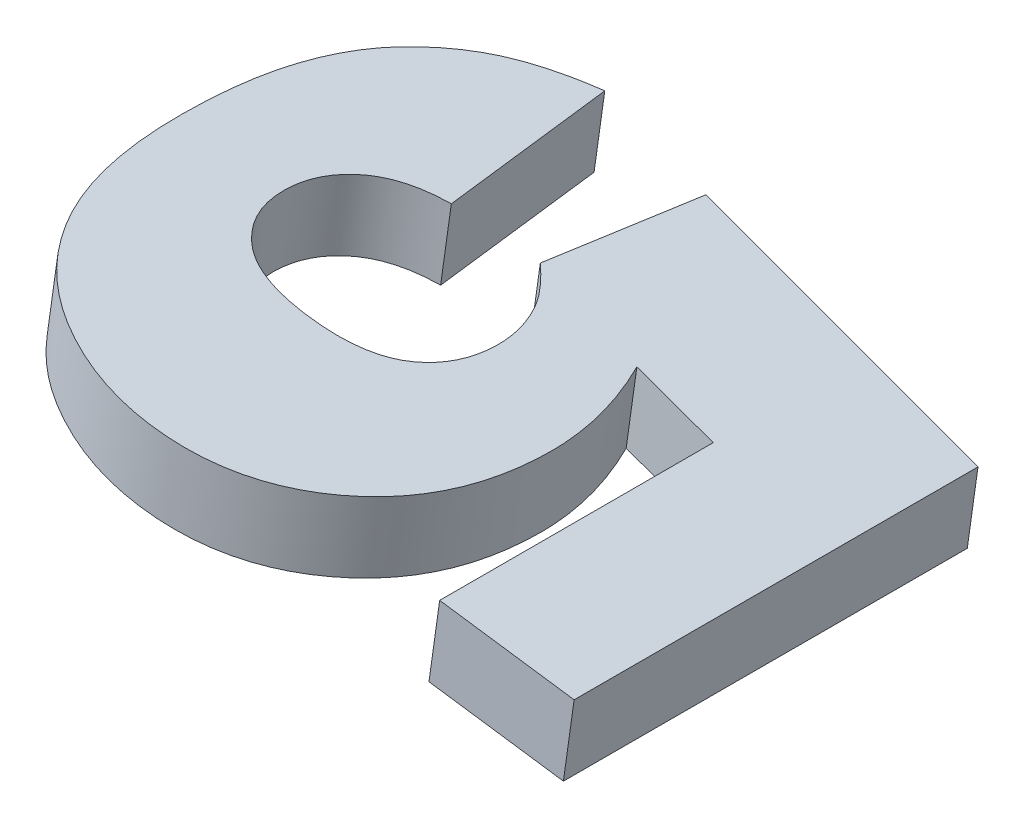
ISO-10303-21;
HEADER;
FILE_DESCRIPTION(('STEP AP214'),'2;1');
FILE_NAME('part.step','',(''),(''),'','','');
FILE_SCHEMA(('AUTOMOTIVE_DESIGN { 1 0 10303 214 1 1 1 1 }'));
ENDSEC;
DATA;
#1=APPLICATION_CONTEXT('core data for automotive mechanical design processes');
#2=APPLICATION_PROTOCOL_DEFINITION('international standard','automotive_design',2000,#1);
#3=PRODUCT_CONTEXT('',#1,'mechanical');
#4=PRODUCT('Part','Part','',(#3));
#5=PRODUCT_RELATED_PRODUCT_CATEGORY('part','',(#4));
#6=PRODUCT_DEFINITION_FORMATION('','',#4);
#7=PRODUCT_DEFINITION_CONTEXT('part definition',#1,'design');
#8=PRODUCT_DEFINITION('design','',#6,#7);
#9=PRODUCT_DEFINITION_SHAPE('','',#8);
#10=(LENGTH_UNIT() NAMED_UNIT(*) SI_UNIT(.MILLI.,.METRE.));
#11=(NAMED_UNIT(*) PLANE_ANGLE_UNIT() SI_UNIT($,.RADIAN.));
#12=(NAMED_UNIT(*) SI_UNIT($,.STERADIAN.) SOLID_ANGLE_UNIT());
#13=UNCERTAINTY_MEASURE_WITH_UNIT(LENGTH_MEASURE(1.E-05),#10,'distance_accuracy_value','');
#14=(GEOMETRIC_REPRESENTATION_CONTEXT(3) GLOBAL_UNCERTAINTY_ASSIGNED_CONTEXT((#13)) GLOBAL_UNIT_ASSIGNED_CONTEXT((#10,
#11,#12)) REPRESENTATION_CONTEXT('',''));
#15=CARTESIAN_POINT('',(0.,0.,0.));
#16=DIRECTION('',(0.,0.,1.));
#17=DIRECTION('',(1.,0.,0.));
#18=AXIS2_PLACEMENT_3D('',#15,#16,#17);
#19=CARTESIAN_POINT('',(883.792924410687,612.161776448019,2523.15525596255));
#20=DIRECTION('',(0.990268068741567,-0.139173100960088,0.));
#21=DIRECTION('',(-0.000106014336868243,-0.000754331202662148,-0.999999709872657));
#22=AXIS2_PLACEMENT_3D('',#19,#20,#21);
#23=PLANE('',#22);
#24=CARTESIAN_POINT('',(882.401193804865,602.259098633641,2523.16287340703));
#25=CARTESIAN_POINT('',(882.403990963494,602.279001451458,2549.54758607952));
#26=CARTESIAN_POINT('',(882.406788122123,602.298904269274,2575.93229875201));
#27=B_SPLINE_CURVE_WITH_KNOTS('',2,(#24,#25,#26),.UNSPECIFIED.,.F.,.F.,(3,3),(0.,1.),.UNSPECIFIED.);
#28=CARTESIAN_POINT('',(882.401193804865,602.259098633641,2523.16287340703));
#29=VERTEX_POINT('',#28);
#30=CARTESIAN_POINT('',(882.406788122123,602.298904269274,2575.93229875201));
#31=VERTEX_POINT('',#30);
#32=EDGE_CURVE('E129',#29,#31,#27,.T.);
#33=ORIENTED_EDGE('',*,*,#32,.F.);
#34=DIRECTION('',(-0.139173060582166,-0.990267781437723,0.000761744447259926));
#35=VECTOR('',#34,1.);
#36=CARTESIAN_POINT('',(883.792924410687,612.161776448019,2523.15525596255));
#37=LINE('',#36,#35);
#38=CARTESIAN_POINT('',(883.792924410687,612.161776448019,2523.15525596255));
#39=VERTEX_POINT('',#38);
#40=EDGE_CURVE('E33',#39,#29,#37,.T.);
#41=ORIENTED_EDGE('',*,*,#40,.F.);
#42=CARTESIAN_POINT('',(883.792924410687,612.161776448019,2523.15525596255));
#43=CARTESIAN_POINT('',(883.795721569316,612.181679265835,2549.53996863505));
#44=CARTESIAN_POINT('',(883.798518727945,612.201582083652,2575.92468130754));
#45=B_SPLINE_CURVE_WITH_KNOTS('',2,(#42,#43,#44),.UNSPECIFIED.,.F.,.F.,(3,3),(0.,1.),.UNSPECIFIED.);
#46=CARTESIAN_POINT('',(883.798518727945,612.201582083652,2575.92468130754));
#47=VERTEX_POINT('',#46);
#48=EDGE_CURVE('E197',#39,#47,#45,.T.);
#49=ORIENTED_EDGE('',*,*,#48,.T.);
#50=DIRECTION('',(-0.139173060582166,-0.990267781437723,0.000761744447259926));
#51=VECTOR('',#50,1.);
#52=CARTESIAN_POINT('',(883.798518727945,612.201582083652,2575.92468130754));
#53=LINE('',#52,#51);
#54=EDGE_CURVE('E11',#47,#31,#53,.T.);
#55=ORIENTED_EDGE('',*,*,#54,.T.);
#56=EDGE_LOOP('',(#33,#41,#49,#55));
#57=FACE_BOUND('',#56,.T.);
#58=ADVANCED_FACE('F17',(#57),#23,.T.);
#59=CARTESIAN_POINT('',(883.798518727945,612.201582083652,2575.92468130754));
#60=DIRECTION('',(0.000106014336856752,0.000754331202663758,0.999999709872657));
#61=DIRECTION('',(0.990268068741567,-0.139173100960088,0.));
#62=AXIS2_PLACEMENT_3D('',#59,#60,#61);
#63=PLANE('',#62);
#64=CARTESIAN_POINT('',(882.406788122123,602.298904269274,2575.93229875201));
#65=CARTESIAN_POINT('',(873.625420527552,603.533045000844,2575.93229875201));
#66=CARTESIAN_POINT('',(864.844052932982,604.767185732414,2575.93229875201));
#67=B_SPLINE_CURVE_WITH_KNOTS('',2,(#64,#65,#66),.UNSPECIFIED.,.F.,.F.,(3,3),(1.,2.),.UNSPECIFIED.);
#68=CARTESIAN_POINT('',(864.844052932982,604.767185732414,2575.93229875201));
#69=VERTEX_POINT('',#68);
#70=EDGE_CURVE('E137',#31,#69,#67,.T.);
#71=ORIENTED_EDGE('',*,*,#70,.F.);
#72=ORIENTED_EDGE('',*,*,#54,.F.);
#73=CARTESIAN_POINT('',(883.798518727945,612.201582083652,2575.92468130754));
#74=CARTESIAN_POINT('',(875.017151133374,613.435722815221,2575.92468130754));
#75=CARTESIAN_POINT('',(866.235783538803,614.669863546791,2575.92468130754));
#76=B_SPLINE_CURVE_WITH_KNOTS('',2,(#73,#74,#75),.UNSPECIFIED.,.F.,.F.,(3,3),(1.,2.),.UNSPECIFIED.);
#77=CARTESIAN_POINT('',(866.235783538803,614.669863546791,2575.92468130754));
#78=VERTEX_POINT('',#77);
#79=EDGE_CURVE('E211',#47,#78,#76,.T.);
#80=ORIENTED_EDGE('',*,*,#79,.T.);
#81=DIRECTION('',(-0.139173060582166,-0.990267781437723,0.000761744447259926));
#82=VECTOR('',#81,1.);
#83=CARTESIAN_POINT('',(866.235783538803,614.669863546791,2575.92468130754));
#84=LINE('',#83,#82);
#85=EDGE_CURVE('E25',#78,#69,#84,.T.);
#86=ORIENTED_EDGE('',*,*,#85,.T.);
#87=EDGE_LOOP('',(#71,#72,#80,#86));
#88=FACE_BOUND('',#87,.T.);
#89=ADVANCED_FACE('F210',(#88),#63,.T.);
#90=CARTESIAN_POINT('',(866.235783538803,614.669863546791,2575.92468130754));
#91=DIRECTION('',(-0.990268068741567,0.139173100960088,0.));
#92=DIRECTION('',(0.000106014336864579,0.000754331202662655,0.999999709872657));
#93=AXIS2_PLACEMENT_3D('',#90,#91,#92);
#94=PLANE('',#93);
#95=CARTESIAN_POINT('',(864.844052932982,604.767185732414,2575.93229875201));
#96=CARTESIAN_POINT('',(864.842158270208,604.753704506281,2558.06054404624));
#97=CARTESIAN_POINT('',(864.840263607435,604.740223280149,2540.18878934046));
#98=B_SPLINE_CURVE_WITH_KNOTS('',2,(#95,#96,#97),.UNSPECIFIED.,.F.,.F.,(3,3),(2.,3.),.UNSPECIFIED.);
#99=CARTESIAN_POINT('',(864.840263607435,604.740223280149,2540.18878934046));
#100=VERTEX_POINT('',#99);
#101=EDGE_CURVE('E145',#69,#100,#98,.T.);
#102=ORIENTED_EDGE('',*,*,#101,.F.);
#103=ORIENTED_EDGE('',*,*,#85,.F.);
#104=CARTESIAN_POINT('',(866.235783538803,614.669863546791,2575.92468130754));
#105=CARTESIAN_POINT('',(866.23388887603,614.656382320658,2558.05292660177));
#106=CARTESIAN_POINT('',(866.231994213256,614.642901094527,2540.18117189599));
#107=B_SPLINE_CURVE_WITH_KNOTS('',2,(#104,#105,#106),.UNSPECIFIED.,.F.,.F.,(3,3),(2.,3.),.UNSPECIFIED.);
#108=CARTESIAN_POINT('',(866.231994213256,614.642901094527,2540.18117189599));
#109=VERTEX_POINT('',#108);
#110=EDGE_CURVE('E220',#78,#109,#107,.T.);
#111=ORIENTED_EDGE('',*,*,#110,.T.);
#112=DIRECTION('',(-0.139173060582166,-0.990267781437723,0.000761744447259926));
#113=VECTOR('',#112,1.);
#114=CARTESIAN_POINT('',(866.231994213256,614.642901094527,2540.18117189599));
#115=LINE('',#114,#113);
#116=EDGE_CURVE('E208',#109,#100,#115,.T.);
#117=ORIENTED_EDGE('',*,*,#116,.T.);
#118=EDGE_LOOP('',(#102,#103,#111,#117));
#119=FACE_BOUND('',#118,.T.);
#120=ADVANCED_FACE('F215',(#119),#94,.T.);
#121=CARTESIAN_POINT('',(866.231994213256,614.642901094527,2540.18117189599));
#122=DIRECTION('',(-0.15548131820988,0.0226111511801645,0.987580019811066));
#123=DIRECTION('',(0.977985899129385,-0.137326096896103,0.15711500315174));
#124=AXIS2_PLACEMENT_3D('',#121,#122,#123);
#125=PLANE('',#124);
#126=CARTESIAN_POINT('',(864.840263607435,604.740223280149,2540.18878934046));
#127=CARTESIAN_POINT('',(858.895851994203,605.574921250658,2539.23381008138));
#128=CARTESIAN_POINT('',(852.951440380972,606.409619221166,2538.27883082229));
#129=B_SPLINE_CURVE_WITH_KNOTS('',2,(#126,#127,#128),.UNSPECIFIED.,.F.,.F.,(3,3),(3.,4.),.UNSPECIFIED.);
#130=CARTESIAN_POINT('',(852.951440380972,606.409619221166,2538.27883082229));
#131=VERTEX_POINT('',#130);
#132=EDGE_CURVE('E153',#100,#131,#129,.T.);
#133=ORIENTED_EDGE('',*,*,#132,.F.);
#134=ORIENTED_EDGE('',*,*,#116,.F.);
#135=CARTESIAN_POINT('',(866.231994213256,614.642901094527,2540.18117189599));
#136=CARTESIAN_POINT('',(860.287582600025,615.477599065035,2539.2261926369));
#137=CARTESIAN_POINT('',(854.343170986794,616.312297035543,2538.27121337782));
#138=B_SPLINE_CURVE_WITH_KNOTS('',2,(#135,#136,#137),.UNSPECIFIED.,.F.,.F.,(3,3),(3.,4.),.UNSPECIFIED.);
#139=CARTESIAN_POINT('',(854.343170986794,616.312297035543,2538.27121337782));
#140=VERTEX_POINT('',#139);
#141=EDGE_CURVE('E236',#109,#140,#138,.T.);
#142=ORIENTED_EDGE('',*,*,#141,.T.);
#143=DIRECTION('',(-0.139173060582166,-0.990267781437723,0.000761744447259926));
#144=VECTOR('',#143,1.);
#145=CARTESIAN_POINT('',(854.343170986794,616.312297035543,2538.27121337782));
#146=LINE('',#145,#144);
#147=EDGE_CURVE('E206',#140,#131,#146,.T.);
#148=ORIENTED_EDGE('',*,*,#147,.T.);
#149=EDGE_LOOP('',(#133,#134,#142,#148));
#150=FACE_BOUND('',#149,.T.);
#151=ADVANCED_FACE('F263',(#150),#125,.T.);
#152=CARTESIAN_POINT('',(854.343170986794,616.312297035543,2538.27121337782));
#153=CARTESIAN_POINT('',(856.072818308738,616.072065400676,2541.98198992741));
#154=CARTESIAN_POINT('',(856.937829989681,615.953287414843,2545.61091111195));
#155=CARTESIAN_POINT('',(857.802841670623,615.83450942901,2549.23983229648));
#156=CARTESIAN_POINT('',(857.803217710563,615.837185092212,2552.78689811594));
#157=CARTESIAN_POINT('',(857.804490461128,615.846241183049,2564.79235165875));
#158=CARTESIAN_POINT('',(850.618071406368,616.861977379636,2572.26847500132));
#159=CARTESIAN_POINT('',(843.431652351608,617.877713576223,2579.74459834388));
#160=CARTESIAN_POINT('',(832.515736941742,619.411845439466,2579.74459834388));
#161=CARTESIAN_POINT('',(824.842172643717,620.490294571053,2579.74459834388));
#162=CARTESIAN_POINT('',(817.762631524159,621.482299803031,2575.89739618585));
#163=CARTESIAN_POINT('',(810.683090404601,622.474305035008,2572.05019402781));
#164=CARTESIAN_POINT('',(806.95363743872,622.993009432034,2564.98334751057));
#165=CARTESIAN_POINT('',(803.224184472837,623.51171382906,2557.91650099332));
#166=CARTESIAN_POINT('',(803.223015856409,623.50339869111,2546.89331183129));
#167=CARTESIAN_POINT('',(803.222176998082,623.497429903967,2538.98062654171));
#168=CARTESIAN_POINT('',(804.70765581972,623.284314839527,2533.33260635225));
#169=CARTESIAN_POINT('',(806.193134641359,623.071199775086,2527.68458616279));
#170=CARTESIAN_POINT('',(809.137850805451,622.654303566926,2523.72824351801));
#171=CARTESIAN_POINT('',(812.082566969544,622.237407358767,2519.77190087321));
#172=CARTESIAN_POINT('',(815.811010412818,621.711519835146,2517.31623992128));
#173=CARTESIAN_POINT('',(819.539453856093,621.185632311524,2514.86057896934));
#174=CARTESIAN_POINT('',(825.105316374526,620.402142034036,2513.22347166804));
#175=B_SPLINE_CURVE_WITH_KNOTS('',2,(#152,#153,#154,#155,#156,#157,#158,#159,#160,#161,#162,
#163,#164,#165,#166,#167,#168,#169,#170,#171,#172,#173,#174),.UNSPECIFIED.,.F.,.F.,(3,2,2,2,2,2,
2,2,2,2,2,3),(4.,5.,6.,7.,8.,9.,10.,11.,12.,13.,14.,15.),.UNSPECIFIED.);
#176=DIRECTION('',(-0.139173060582166,-0.990267781437723,0.000761744447259926));
#177=VECTOR('',#176,1.);
#178=SURFACE_OF_LINEAR_EXTRUSION('',#175,#177);
#179=CARTESIAN_POINT('',(852.951440380972,606.409619221166,2538.27883082229));
#180=CARTESIAN_POINT('',(854.681087702917,606.169387586298,2541.98960737188));
#181=CARTESIAN_POINT('',(855.546099383859,606.050609600466,2545.61852855642));
#182=CARTESIAN_POINT('',(856.411111064801,605.931831614633,2549.24744974095));
#183=CARTESIAN_POINT('',(856.411487104741,605.934507277835,2552.79451556041));
#184=CARTESIAN_POINT('',(856.412759855306,605.943563368672,2564.79996910323));
#185=CARTESIAN_POINT('',(849.226340800546,606.959299565259,2572.27609244579));
#186=CARTESIAN_POINT('',(842.039921745786,607.975035761846,2579.75221578836));
#187=CARTESIAN_POINT('',(831.12400633592,609.509167625089,2579.75221578836));
#188=CARTESIAN_POINT('',(823.450442037895,610.587616756676,2579.75221578836));
#189=CARTESIAN_POINT('',(816.370900918337,611.579621988653,2575.90501363032));
#190=CARTESIAN_POINT('',(809.29135979878,612.571627220631,2572.05781147228));
#191=CARTESIAN_POINT('',(805.561906832898,613.090331617657,2564.99096495504));
#192=CARTESIAN_POINT('',(801.832453867016,613.609036014683,2557.9241184378));
#193=CARTESIAN_POINT('',(801.831285250587,613.600720876733,2546.90092927576));
#194=CARTESIAN_POINT('',(801.83044639226,613.59475208959,2538.98824398619));
#195=CARTESIAN_POINT('',(803.315925213899,613.381637025149,2533.34022379673));
#196=CARTESIAN_POINT('',(804.801404035538,613.168521960709,2527.69220360727));
#197=CARTESIAN_POINT('',(807.74612019963,612.751625752549,2523.73586096247));
#198=CARTESIAN_POINT('',(810.690836363722,612.33472954439,2519.77951831769));
#199=CARTESIAN_POINT('',(814.419279806997,611.808842020768,2517.32385736575));
#200=CARTESIAN_POINT('',(818.147723250271,611.282954497147,2514.86819641381));
#201=CARTESIAN_POINT('',(823.713585768704,610.499464219659,2513.23108911252));
#202=B_SPLINE_CURVE_WITH_KNOTS('',2,(#179,#180,#181,#182,#183,#184,#185,#186,#187,#188,#189,
#190,#191,#192,#193,#194,#195,#196,#197,#198,#199,#200,#201),.UNSPECIFIED.,.F.,.F.,(3,2,2,2,2,2,
2,2,2,2,2,3),(4.,5.,6.,7.,8.,9.,10.,11.,12.,13.,14.,15.),.UNSPECIFIED.);
#203=CARTESIAN_POINT('',(823.713585768704,610.499464219659,2513.23108911252));
#204=VERTEX_POINT('',#203);
#205=EDGE_CURVE('E161',#131,#204,#202,.T.);
#206=ORIENTED_EDGE('',*,*,#205,.F.);
#207=ORIENTED_EDGE('',*,*,#147,.F.);
#208=CARTESIAN_POINT('',(825.105316374526,620.402142034036,2513.22347166804));
#209=VERTEX_POINT('',#208);
#210=EDGE_CURVE('E244',#140,#209,#175,.T.);
#211=ORIENTED_EDGE('',*,*,#210,.T.);
#212=DIRECTION('',(-0.139173060582166,-0.990267781437723,0.000761744447259926));
#213=VECTOR('',#212,1.);
#214=CARTESIAN_POINT('',(825.105316374526,620.402142034036,2513.22347166804));
#215=LINE('',#214,#213);
#216=EDGE_CURVE('E204',#209,#204,#215,.T.);
#217=ORIENTED_EDGE('',*,*,#216,.T.);
#218=EDGE_LOOP('',(#206,#207,#211,#217));
#219=FACE_BOUND('',#218,.T.);
#220=ADVANCED_FACE('F258',(#219),#178,.T.);
#221=CARTESIAN_POINT('',(825.105316374526,620.402142034036,2513.22347166804));
#222=DIRECTION('',(0.984402072928775,-0.138432210196109,-0.108577539084982));
#223=DIRECTION('',(-0.107626288711092,0.014361205612012,-0.99408769117802));
#224=AXIS2_PLACEMENT_3D('',#221,#222,#223);
#225=PLANE('',#224);
#226=CARTESIAN_POINT('',(823.713585768704,610.499464219659,2513.23108911252));
#227=CARTESIAN_POINT('',(824.930659192992,610.337062989435,2524.47255924806));
#228=CARTESIAN_POINT('',(826.14773261728,610.174661759211,2535.7140293836));
#229=B_SPLINE_CURVE_WITH_KNOTS('',2,(#226,#227,#228),.UNSPECIFIED.,.F.,.F.,(3,3),(15.,16.),.UNSPECIFIED.);
#230=CARTESIAN_POINT('',(826.14773261728,610.174661759211,2535.7140293836));
#231=VERTEX_POINT('',#230);
#232=EDGE_CURVE('E169',#204,#231,#229,.T.);
#233=ORIENTED_EDGE('',*,*,#232,.F.);
#234=ORIENTED_EDGE('',*,*,#216,.F.);
#235=CARTESIAN_POINT('',(825.105316374526,620.402142034036,2513.22347166804));
#236=CARTESIAN_POINT('',(826.322389798814,620.239740803812,2524.46494180359));
#237=CARTESIAN_POINT('',(827.539463223102,620.077339573588,2535.70641193912));
#238=B_SPLINE_CURVE_WITH_KNOTS('',2,(#235,#236,#237),.UNSPECIFIED.,.F.,.F.,(3,3),(15.,16.),.UNSPECIFIED.);
#239=CARTESIAN_POINT('',(827.539463223102,620.077339573588,2535.70641193912));
#240=VERTEX_POINT('',#239);
#241=EDGE_CURVE('E110',#209,#240,#238,.T.);
#242=ORIENTED_EDGE('',*,*,#241,.T.);
#243=DIRECTION('',(-0.139173060582166,-0.990267781437723,0.000761744447259926));
#244=VECTOR('',#243,1.);
#245=CARTESIAN_POINT('',(827.539463223102,620.077339573588,2535.70641193912));
#246=LINE('',#245,#244);
#247=EDGE_CURVE('E102',#240,#231,#246,.T.);
#248=ORIENTED_EDGE('',*,*,#247,.T.);
#249=EDGE_LOOP('',(#233,#234,#242,#248));
#250=FACE_BOUND('',#249,.T.);
#251=ADVANCED_FACE('F262',(#250),#225,.T.);
#252=CARTESIAN_POINT('',(827.539463223102,620.077339573588,2535.70641193912));
#253=CARTESIAN_POINT('',(822.189670667011,620.82983354156,2536.52496558977));
#254=CARTESIAN_POINT('',(819.406970816989,621.223225242275,2539.52632897547));
#255=CARTESIAN_POINT('',(816.624270966966,621.616616942989,2542.52769236118));
#256=CARTESIAN_POINT('',(816.624710644434,621.619745410733,2546.67503085778));
#257=CARTESIAN_POINT('',(816.625202388971,621.62324435492,2551.31350154478));
#258=CARTESIAN_POINT('',(820.111050914456,621.135670023123,2554.34215005217));
#259=CARTESIAN_POINT('',(823.596899439942,620.648095691326,2557.37079855956));
#260=CARTESIAN_POINT('',(830.513915145204,619.675972530459,2557.37079855956));
#261=CARTESIAN_POINT('',(837.593048406058,618.681065233009,2557.37079855956));
#262=CARTESIAN_POINT('',(840.889114730225,618.215482602399,2554.31486493048));
#263=CARTESIAN_POINT('',(844.185181054393,617.74989997179,2551.2589313014));
#264=CARTESIAN_POINT('',(844.184643028018,617.746071715209,2546.18389866739));
#265=CARTESIAN_POINT('',(844.184301699457,617.743643036303,2542.96425430819));
#266=CARTESIAN_POINT('',(842.631901260723,617.95950385778,2539.95497274105));
#267=CARTESIAN_POINT('',(841.481787057524,618.119426897288,2537.72551094406));
#268=CARTESIAN_POINT('',(838.509348395407,618.535119029559,2535.05156901861));
#269=B_SPLINE_CURVE_WITH_KNOTS('',2,(#252,#253,#254,#255,#256,#257,#258,#259,#260,#261,#262,
#263,#264,#265,#266,#267,#268),.UNSPECIFIED.,.F.,.F.,(3,2,2,2,2,2,2,2,3),(16.,17.,18.,19.,20.,
21.,22.,23.,24.),.UNSPECIFIED.);
#270=DIRECTION('',(-0.139173060582166,-0.990267781437723,0.000761744447259926));
#271=VECTOR('',#270,1.);
#272=SURFACE_OF_LINEAR_EXTRUSION('',#269,#271);
#273=CARTESIAN_POINT('',(826.14773261728,610.174661759211,2535.7140293836));
#274=CARTESIAN_POINT('',(820.79794006119,610.927155727183,2536.53258303424));
#275=CARTESIAN_POINT('',(818.015240211167,611.320547427897,2539.53394641995));
#276=CARTESIAN_POINT('',(815.232540361145,611.713939128612,2542.53530980565));
#277=CARTESIAN_POINT('',(815.232980038612,611.717067596355,2546.68264830226));
#278=CARTESIAN_POINT('',(815.233471783149,611.720566540542,2551.32111898925));
#279=CARTESIAN_POINT('',(818.719320308635,611.232992208746,2554.34976749664));
#280=CARTESIAN_POINT('',(822.205168834121,610.745417876949,2557.37841600403));
#281=CARTESIAN_POINT('',(829.122184539382,609.773294716081,2557.37841600403));
#282=CARTESIAN_POINT('',(836.201317800236,608.778387418631,2557.37841600403));
#283=CARTESIAN_POINT('',(839.497384124404,608.312804788022,2554.32248237496));
#284=CARTESIAN_POINT('',(842.793450448571,607.847222157413,2551.26654874587));
#285=CARTESIAN_POINT('',(842.792912422196,607.843393900832,2546.19151611187));
#286=CARTESIAN_POINT('',(842.792571093635,607.840965221926,2542.97187175266));
#287=CARTESIAN_POINT('',(841.240170654901,608.056826043403,2539.96259018552));
#288=CARTESIAN_POINT('',(840.090056451703,608.216749082911,2537.73312838853));
#289=CARTESIAN_POINT('',(837.117617789586,608.632441215182,2535.05918646308));
#290=B_SPLINE_CURVE_WITH_KNOTS('',2,(#273,#274,#275,#276,#277,#278,#279,#280,#281,#282,#283,
#284,#285,#286,#287,#288,#289),.UNSPECIFIED.,.F.,.F.,(3,2,2,2,2,2,2,2,3),(16.,17.,18.,19.,20.,
21.,22.,23.,24.),.UNSPECIFIED.);
#291=CARTESIAN_POINT('',(837.117617789586,608.632441215182,2535.05918646308));
#292=VERTEX_POINT('',#291);
#293=EDGE_CURVE('E177',#231,#292,#290,.T.);
#294=ORIENTED_EDGE('',*,*,#293,.F.);
#295=ORIENTED_EDGE('',*,*,#247,.F.);
#296=CARTESIAN_POINT('',(838.509348395407,618.535119029559,2535.05156901861));
#297=VERTEX_POINT('',#296);
#298=EDGE_CURVE('E105',#240,#297,#269,.T.);
#299=ORIENTED_EDGE('',*,*,#298,.T.);
#300=DIRECTION('',(-0.139173060582166,-0.990267781437723,0.000761744447259926));
#301=VECTOR('',#300,1.);
#302=CARTESIAN_POINT('',(838.509348395407,618.535119029559,2535.05156901861));
#303=LINE('',#302,#301);
#304=EDGE_CURVE('E91',#297,#292,#303,.T.);
#305=ORIENTED_EDGE('',*,*,#304,.T.);
#306=EDGE_LOOP('',(#294,#295,#299,#305));
#307=FACE_BOUND('',#306,.T.);
#308=ADVANCED_FACE('F106',(#307),#272,.T.);
#309=CARTESIAN_POINT('',(838.509348395407,618.535119029559,2535.05156901861));
#310=DIRECTION('',(-0.980160297537575,0.137642839271143,-0.142619213040986));
#311=DIRECTION('',(-0.141126363019972,0.0205953840408079,0.989777338504457));
#312=AXIS2_PLACEMENT_3D('',#309,#310,#311);
#313=PLANE('',#312);
#314=CARTESIAN_POINT('',(837.117617789586,608.632441215182,2535.05918646308));
#315=CARTESIAN_POINT('',(838.467593682142,608.435431447779,2525.59124923727));
#316=CARTESIAN_POINT('',(839.817569574698,608.238421680376,2516.12331201147));
#317=B_SPLINE_CURVE_WITH_KNOTS('',2,(#314,#315,#316),.UNSPECIFIED.,.F.,.F.,(3,3),(24.,25.),.UNSPECIFIED.);
#318=CARTESIAN_POINT('',(839.817569574698,608.238421680376,2516.12331201147));
#319=VERTEX_POINT('',#318);
#320=EDGE_CURVE('E98',#292,#319,#317,.T.);
#321=ORIENTED_EDGE('',*,*,#320,.F.);
#322=ORIENTED_EDGE('',*,*,#304,.F.);
#323=CARTESIAN_POINT('',(838.509348395407,618.535119029559,2535.05156901861));
#324=CARTESIAN_POINT('',(839.859324287963,618.338109262156,2525.5836317928));
#325=CARTESIAN_POINT('',(841.20930018052,618.141099494753,2516.11569456699));
#326=B_SPLINE_CURVE_WITH_KNOTS('',2,(#323,#324,#325),.UNSPECIFIED.,.F.,.F.,(3,3),(24.,25.),.UNSPECIFIED.);
#327=CARTESIAN_POINT('',(841.20930018052,618.141099494753,2516.11569456699));
#328=VERTEX_POINT('',#327);
#329=EDGE_CURVE('E95',#297,#328,#326,.T.);
#330=ORIENTED_EDGE('',*,*,#329,.T.);
#331=DIRECTION('',(-0.139173060582166,-0.990267781437723,0.000761744447259926));
#332=VECTOR('',#331,1.);
#333=CARTESIAN_POINT('',(841.20930018052,618.141099494753,2516.11569456699));
#334=LINE('',#333,#332);
#335=EDGE_CURVE('E64',#328,#319,#334,.T.);
#336=ORIENTED_EDGE('',*,*,#335,.T.);
#337=EDGE_LOOP('',(#321,#322,#330,#336));
#338=FACE_BOUND('',#337,.T.);
#339=ADVANCED_FACE('F93',(#338),#313,.T.);
#340=CARTESIAN_POINT('',(841.20930018052,618.141099494753,2516.11569456699));
#341=DIRECTION('',(0.15987823231944,-0.0232285459191622,-0.986863407714002));
#342=DIRECTION('',(-0.977276731554888,0.137223014472396,-0.161555050247599));
#343=AXIS2_PLACEMENT_3D('',#340,#341,#342);
#344=PLANE('',#343);
#345=CARTESIAN_POINT('',(839.817569574698,608.238421680376,2516.12331201147));
#346=CARTESIAN_POINT('',(861.109381689782,605.248760157008,2519.64309270925));
#347=CARTESIAN_POINT('',(882.401193804865,602.259098633641,2523.16287340703));
#348=B_SPLINE_CURVE_WITH_KNOTS('',2,(#345,#346,#347),.UNSPECIFIED.,.F.,.F.,(3,3),(25.,26.),.UNSPECIFIED.);
#349=EDGE_CURVE('E190',#319,#29,#348,.T.);
#350=ORIENTED_EDGE('',*,*,#349,.F.);
#351=ORIENTED_EDGE('',*,*,#335,.F.);
#352=CARTESIAN_POINT('',(841.20930018052,618.141099494753,2516.11569456699));
#353=CARTESIAN_POINT('',(862.501112295603,615.151437971386,2519.63547526477));
#354=CARTESIAN_POINT('',(883.792924410687,612.161776448019,2523.15525596255));
#355=B_SPLINE_CURVE_WITH_KNOTS('',2,(#352,#353,#354),.UNSPECIFIED.,.F.,.F.,(3,3),(25.,26.),.UNSPECIFIED.);
#356=EDGE_CURVE('E114',#328,#39,#355,.T.);
#357=ORIENTED_EDGE('',*,*,#356,.T.);
#358=ORIENTED_EDGE('',*,*,#40,.T.);
#359=EDGE_LOOP('',(#350,#351,#357,#358));
#360=FACE_BOUND('',#359,.T.);
#361=ADVANCED_FACE('F330',(#360),#344,.T.);
#362=CARTESIAN_POINT('',(811.52061244302,622.35597982627,2571.24528293801));
#363=DIRECTION('',(0.139173060582687,0.99026778143765,-0.000761744447447724));
#364=DIRECTION('',(-0.947941965636642,0.133001987377734,-0.289338039563609));
#365=AXIS2_PLACEMENT_3D('',#362,#363,#364);
#366=PLANE('',#365);
#367=ORIENTED_EDGE('',*,*,#48,.F.);
#368=ORIENTED_EDGE('',*,*,#356,.F.);
#369=ORIENTED_EDGE('',*,*,#329,.F.);
#370=ORIENTED_EDGE('',*,*,#298,.F.);
#371=ORIENTED_EDGE('',*,*,#241,.F.);
#372=ORIENTED_EDGE('',*,*,#210,.F.);
#373=ORIENTED_EDGE('',*,*,#141,.F.);
#374=ORIENTED_EDGE('',*,*,#110,.F.);
#375=ORIENTED_EDGE('',*,*,#79,.F.);
#376=EDGE_LOOP('',(#367,#368,#369,#370,#371,#372,#373,#374,#375));
#377=FACE_BOUND('',#376,.T.);
#378=ADVANCED_FACE('F113',(#377),#366,.T.);
#379=CARTESIAN_POINT('',(810.128881837199,612.453302011893,2571.25290038249));
#380=DIRECTION('',(0.139173060582687,0.99026778143765,-0.000761744447447724));
#381=DIRECTION('',(-0.947941965636642,0.133001987377734,-0.289338039563609));
#382=AXIS2_PLACEMENT_3D('',#379,#380,#381);
#383=PLANE('',#382);
#384=ORIENTED_EDGE('',*,*,#32,.T.);
#385=ORIENTED_EDGE('',*,*,#70,.T.);
#386=ORIENTED_EDGE('',*,*,#101,.T.);
#387=ORIENTED_EDGE('',*,*,#132,.T.);
#388=ORIENTED_EDGE('',*,*,#205,.T.);
#389=ORIENTED_EDGE('',*,*,#232,.T.);
#390=ORIENTED_EDGE('',*,*,#293,.T.);
#391=ORIENTED_EDGE('',*,*,#320,.T.);
#392=ORIENTED_EDGE('',*,*,#349,.T.);
#393=EDGE_LOOP('',(#384,#385,#386,#387,#388,#389,#390,#391,#392));
#394=FACE_BOUND('',#393,.T.);
#395=ADVANCED_FACE('F218',(#394),#383,.F.);
#396=CLOSED_SHELL('',(#58,#89,#120,#151,#220,#251,#308,#339,#361,#378,#395));
#397=MANIFOLD_SOLID_BREP('B1',#396);
#398=ADVANCED_BREP_SHAPE_REPRESENTATION('',(#18,#397),#14);
#399=SHAPE_DEFINITION_REPRESENTATION(#9,#398);
ENDSEC;
END-ISO-10303-21;
